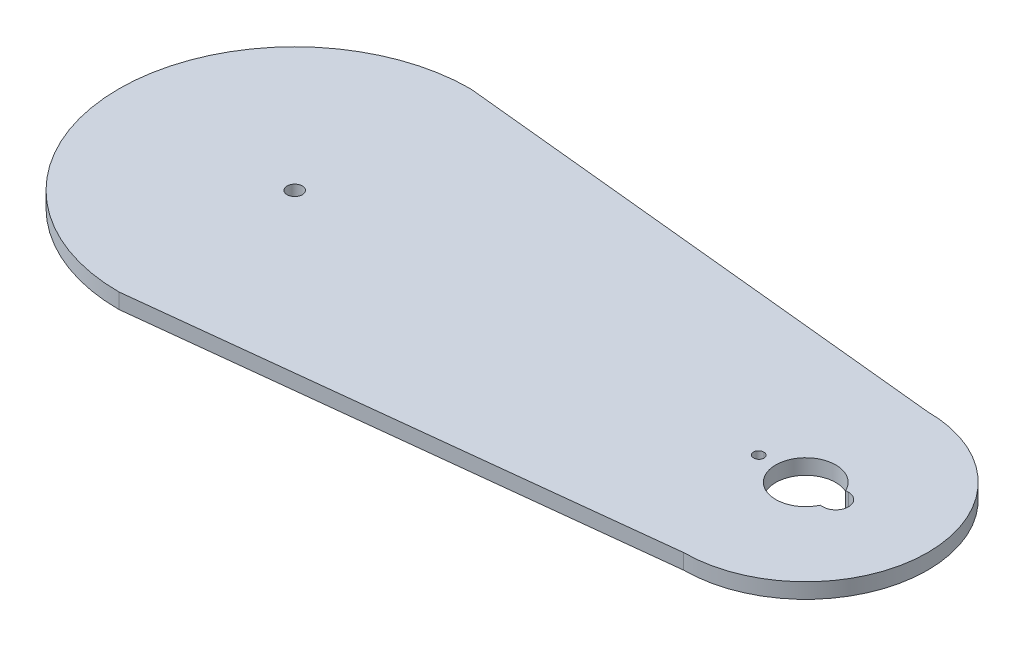
ISO-10303-21;
HEADER;
FILE_DESCRIPTION(('STEP AP214'),'2;1');
FILE_NAME('part.step','',(''),(''),'','','');
FILE_SCHEMA(('AUTOMOTIVE_DESIGN { 1 0 10303 214 1 1 1 1 }'));
ENDSEC;
DATA;
#1=APPLICATION_CONTEXT('core data for automotive mechanical design processes');
#2=APPLICATION_PROTOCOL_DEFINITION('international standard','automotive_design',2000,#1);
#3=PRODUCT_CONTEXT('',#1,'mechanical');
#4=PRODUCT('Part','Part','',(#3));
#5=PRODUCT_RELATED_PRODUCT_CATEGORY('part','',(#4));
#6=PRODUCT_DEFINITION_FORMATION('','',#4);
#7=PRODUCT_DEFINITION_CONTEXT('part definition',#1,'design');
#8=PRODUCT_DEFINITION('design','',#6,#7);
#9=PRODUCT_DEFINITION_SHAPE('','',#8);
#10=(LENGTH_UNIT() NAMED_UNIT(*) SI_UNIT(.MILLI.,.METRE.));
#11=(NAMED_UNIT(*) PLANE_ANGLE_UNIT() SI_UNIT($,.RADIAN.));
#12=(NAMED_UNIT(*) SI_UNIT($,.STERADIAN.) SOLID_ANGLE_UNIT());
#13=UNCERTAINTY_MEASURE_WITH_UNIT(LENGTH_MEASURE(1.E-05),#10,'distance_accuracy_value','');
#14=(GEOMETRIC_REPRESENTATION_CONTEXT(3) GLOBAL_UNCERTAINTY_ASSIGNED_CONTEXT((#13)) GLOBAL_UNIT_ASSIGNED_CONTEXT((#10,
#11,#12)) REPRESENTATION_CONTEXT('',''));
#15=CARTESIAN_POINT('',(0.,0.,0.));
#16=DIRECTION('',(0.,0.,1.));
#17=DIRECTION('',(1.,0.,0.));
#18=AXIS2_PLACEMENT_3D('',#15,#16,#17);
#19=CARTESIAN_POINT('',(0.,3.,-24.));
#20=DIRECTION('',(0.,-1.,0.));
#21=DIRECTION('',(0.,0.,-1.));
#22=AXIS2_PLACEMENT_3D('',#19,#20,#21);
#23=CYLINDRICAL_SURFACE('',#22,24.);
#24=CARTESIAN_POINT('',(0.,0.,-24.));
#25=DIRECTION('',(0.,1.,0.));
#26=DIRECTION('',(0.,0.,-1.));
#27=AXIS2_PLACEMENT_3D('',#24,#25,#26);
#28=CIRCLE('',#27,24.);
#29=CARTESIAN_POINT('',(0.,0.,0.));
#30=VERTEX_POINT('',#29);
#31=CARTESIAN_POINT('',(0.,0.,-48.));
#32=VERTEX_POINT('',#31);
#33=EDGE_CURVE('E143',#30,#32,#28,.T.);
#34=ORIENTED_EDGE('',*,*,#33,.T.);
#35=DIRECTION('',(0.,-1.,0.));
#36=VECTOR('',#35,1.);
#37=CARTESIAN_POINT('',(0.,3.,-48.));
#38=LINE('',#37,#36);
#39=CARTESIAN_POINT('',(0.,3.,-48.));
#40=VERTEX_POINT('',#39);
#41=EDGE_CURVE('E175',#40,#32,#38,.T.);
#42=ORIENTED_EDGE('',*,*,#41,.F.);
#43=CARTESIAN_POINT('',(0.,3.,-24.));
#44=DIRECTION('',(0.,1.,0.));
#45=DIRECTION('',(0.,0.,-1.));
#46=AXIS2_PLACEMENT_3D('',#43,#44,#45);
#47=CIRCLE('',#46,24.);
#48=CARTESIAN_POINT('',(0.,3.,0.));
#49=VERTEX_POINT('',#48);
#50=EDGE_CURVE('E149',#49,#40,#47,.T.);
#51=ORIENTED_EDGE('',*,*,#50,.F.);
#52=DIRECTION('',(0.,-1.,0.));
#53=VECTOR('',#52,1.);
#54=CARTESIAN_POINT('',(0.,3.,0.));
#55=LINE('',#54,#53);
#56=EDGE_CURVE('E159',#49,#30,#55,.T.);
#57=ORIENTED_EDGE('',*,*,#56,.T.);
#58=EDGE_LOOP('',(#34,#42,#51,#57));
#59=FACE_BOUND('',#58,.T.);
#60=ADVANCED_FACE('F33',(#59),#23,.T.);
#61=CARTESIAN_POINT('',(-100.,3.,-58.0615795313177));
#62=DIRECTION('',(-0.10011033594273,0.,0.994976341747599));
#63=DIRECTION('',(0.994976341747599,0.,0.10011033594273));
#64=AXIS2_PLACEMENT_3D('',#61,#62,#63);
#65=PLANE('',#64);
#66=DIRECTION('',(-0.994976341747598,0.,-0.10011033594273));
#67=VECTOR('',#66,1.);
#68=CARTESIAN_POINT('',(-100.,0.,-58.0615795313177));
#69=LINE('',#68,#67);
#70=CARTESIAN_POINT('',(-100.,0.,-58.0615795313177));
#71=VERTEX_POINT('',#70);
#72=EDGE_CURVE('E162',#32,#71,#69,.T.);
#73=ORIENTED_EDGE('',*,*,#72,.T.);
#74=DIRECTION('',(0.,-1.,0.));
#75=VECTOR('',#74,1.);
#76=CARTESIAN_POINT('',(-100.,3.,-58.0615795313177));
#77=LINE('',#76,#75);
#78=CARTESIAN_POINT('',(-100.,3.,-58.0615795313177));
#79=VERTEX_POINT('',#78);
#80=EDGE_CURVE('E172',#79,#71,#77,.T.);
#81=ORIENTED_EDGE('',*,*,#80,.F.);
#82=DIRECTION('',(-0.994976341747598,0.,-0.10011033594273));
#83=VECTOR('',#82,1.);
#84=CARTESIAN_POINT('',(-100.,3.,-58.0615795313177));
#85=LINE('',#84,#83);
#86=EDGE_CURVE('E152',#40,#79,#85,.T.);
#87=ORIENTED_EDGE('',*,*,#86,.F.);
#88=ORIENTED_EDGE('',*,*,#41,.T.);
#89=EDGE_LOOP('',(#73,#81,#87,#88));
#90=FACE_BOUND('',#89,.T.);
#91=ADVANCED_FACE('F209',(#90),#65,.F.);
#92=CARTESIAN_POINT('',(-100.,3.,-23.4579039810428));
#93=DIRECTION('',(0.,-1.,0.));
#94=DIRECTION('',(0.,0.,-1.));
#95=AXIS2_PLACEMENT_3D('',#92,#93,#94);
#96=CYLINDRICAL_SURFACE('',#95,34.6036755502749);
#97=CARTESIAN_POINT('',(-100.,0.,-23.4579039810428));
#98=DIRECTION('',(0.,1.,0.));
#99=DIRECTION('',(0.,0.,1.));
#100=AXIS2_PLACEMENT_3D('',#97,#98,#99);
#101=CIRCLE('',#100,34.6036755502749);
#102=CARTESIAN_POINT('',(-100.,0.,11.1457715692321));
#103=VERTEX_POINT('',#102);
#104=EDGE_CURVE('E164',#71,#103,#101,.T.);
#105=ORIENTED_EDGE('',*,*,#104,.T.);
#106=DIRECTION('',(0.,-1.,0.));
#107=VECTOR('',#106,1.);
#108=CARTESIAN_POINT('',(-100.,3.,11.1457715692321));
#109=LINE('',#108,#107);
#110=CARTESIAN_POINT('',(-100.,3.,11.1457715692321));
#111=VERTEX_POINT('',#110);
#112=EDGE_CURVE('E169',#111,#103,#109,.T.);
#113=ORIENTED_EDGE('',*,*,#112,.F.);
#114=CARTESIAN_POINT('',(-100.,3.,-23.4579039810428));
#115=DIRECTION('',(0.,1.,0.));
#116=DIRECTION('',(0.,0.,1.));
#117=AXIS2_PLACEMENT_3D('',#114,#115,#116);
#118=CIRCLE('',#117,34.6036755502749);
#119=EDGE_CURVE('E155',#79,#111,#118,.T.);
#120=ORIENTED_EDGE('',*,*,#119,.F.);
#121=ORIENTED_EDGE('',*,*,#80,.T.);
#122=EDGE_LOOP('',(#105,#113,#120,#121));
#123=FACE_BOUND('',#122,.T.);
#124=ADVANCED_FACE('F204',(#123),#96,.T.);
#125=CARTESIAN_POINT('',(0.,3.,0.));
#126=DIRECTION('',(-0.110771790261545,0.,-0.993845868574324));
#127=DIRECTION('',(-0.993845868574324,0.,0.110771790261545));
#128=AXIS2_PLACEMENT_3D('',#125,#126,#127);
#129=PLANE('',#128);
#130=DIRECTION('',(0.993845868574324,0.,-0.110771790261545));
#131=VECTOR('',#130,1.);
#132=CARTESIAN_POINT('',(0.,0.,0.));
#133=LINE('',#132,#131);
#134=EDGE_CURVE('E153',#103,#30,#133,.T.);
#135=ORIENTED_EDGE('',*,*,#134,.T.);
#136=ORIENTED_EDGE('',*,*,#56,.F.);
#137=DIRECTION('',(0.993845868574324,0.,-0.110771790261545));
#138=VECTOR('',#137,1.);
#139=CARTESIAN_POINT('',(0.,3.,0.));
#140=LINE('',#139,#138);
#141=EDGE_CURVE('E157',#111,#49,#140,.T.);
#142=ORIENTED_EDGE('',*,*,#141,.F.);
#143=ORIENTED_EDGE('',*,*,#112,.T.);
#144=EDGE_LOOP('',(#135,#136,#142,#143));
#145=FACE_BOUND('',#144,.T.);
#146=ADVANCED_FACE('F196',(#145),#129,.F.);
#147=CARTESIAN_POINT('',(0.,3.,-24.));
#148=DIRECTION('',(0.,-1.,0.));
#149=DIRECTION('',(0.,0.,-1.));
#150=AXIS2_PLACEMENT_3D('',#147,#148,#149);
#151=PLANE('',#150);
#152=CARTESIAN_POINT('',(-100.,3.,-23.4579039810428));
#153=DIRECTION('',(0.,1.,0.));
#154=DIRECTION('',(0.,0.,1.));
#155=AXIS2_PLACEMENT_3D('',#152,#153,#154);
#156=CIRCLE('',#155,1.5);
#157=CARTESIAN_POINT('',(-100.,3.,-21.9579039810428));
#158=VERTEX_POINT('',#157);
#159=EDGE_CURVE('E126',#158,#158,#156,.T.);
#160=ORIENTED_EDGE('',*,*,#159,.F.);
#161=EDGE_LOOP('',(#160));
#162=FACE_BOUND('',#161,.T.);
#163=CARTESIAN_POINT('',(-9.2,3.,-24.));
#164=DIRECTION('',(0.,1.,0.));
#165=DIRECTION('',(0.,0.,1.));
#166=AXIS2_PLACEMENT_3D('',#163,#164,#165);
#167=CIRCLE('',#166,1.);
#168=CARTESIAN_POINT('',(-9.24999999999999,3.,-23.0012507822281));
#169=VERTEX_POINT('',#168);
#170=CARTESIAN_POINT('',(-9.24999999999999,3.,-24.9987492177719));
#171=VERTEX_POINT('',#170);
#172=EDGE_CURVE('E117',#169,#171,#167,.T.);
#173=ORIENTED_EDGE('',*,*,#172,.F.);
#174=CARTESIAN_POINT('',(-9.3,3.,-24.));
#175=DIRECTION('',(0.,1.,0.));
#176=DIRECTION('',(0.,0.,1.));
#177=AXIS2_PLACEMENT_3D('',#174,#175,#176);
#178=CIRCLE('',#177,1.);
#179=EDGE_CURVE('E108',#171,#169,#178,.T.);
#180=ORIENTED_EDGE('',*,*,#179,.F.);
#181=EDGE_LOOP('',(#173,#180));
#182=FACE_BOUND('',#181,.T.);
#183=DIRECTION('',(1.,0.,0.));
#184=VECTOR('',#183,1.);
#185=CARTESIAN_POINT('',(5.90415568635496,3.,-21.5));
#186=LINE('',#185,#184);
#187=CARTESIAN_POINT('',(5.34415568635495,3.,-21.5));
#188=VERTEX_POINT('',#187);
#189=CARTESIAN_POINT('',(5.90415568635496,3.,-21.5));
#190=VERTEX_POINT('',#189);
#191=EDGE_CURVE('E131',#188,#190,#186,.T.);
#192=ORIENTED_EDGE('',*,*,#191,.F.);
#193=CARTESIAN_POINT('',(0.,3.,-24.));
#194=DIRECTION('',(0.,1.,0.));
#195=DIRECTION('',(0.,0.,1.));
#196=AXIS2_PLACEMENT_3D('',#193,#194,#195);
#197=CIRCLE('',#196,5.9);
#198=CARTESIAN_POINT('',(5.34415568635495,3.,-26.5));
#199=VERTEX_POINT('',#198);
#200=EDGE_CURVE('E55',#199,#188,#197,.T.);
#201=ORIENTED_EDGE('',*,*,#200,.F.);
#202=DIRECTION('',(-1.,0.,0.));
#203=VECTOR('',#202,1.);
#204=CARTESIAN_POINT('',(5.34415568635495,3.,-26.5));
#205=LINE('',#204,#203);
#206=CARTESIAN_POINT('',(5.90415568635496,3.,-26.5));
#207=VERTEX_POINT('',#206);
#208=EDGE_CURVE('E137',#207,#199,#205,.T.);
#209=ORIENTED_EDGE('',*,*,#208,.F.);
#210=CARTESIAN_POINT('',(5.90415568635496,3.,-24.));
#211=DIRECTION('',(0.,1.,0.));
#212=DIRECTION('',(0.,0.,-1.));
#213=AXIS2_PLACEMENT_3D('',#210,#211,#212);
#214=CIRCLE('',#213,2.5);
#215=EDGE_CURVE('E134',#190,#207,#214,.T.);
#216=ORIENTED_EDGE('',*,*,#215,.F.);
#217=EDGE_LOOP('',(#192,#201,#209,#216));
#218=FACE_BOUND('',#217,.T.);
#219=ORIENTED_EDGE('',*,*,#50,.T.);
#220=ORIENTED_EDGE('',*,*,#86,.T.);
#221=ORIENTED_EDGE('',*,*,#119,.T.);
#222=ORIENTED_EDGE('',*,*,#141,.T.);
#223=EDGE_LOOP('',(#219,#220,#221,#222));
#224=FACE_BOUND('',#223,.T.);
#225=ADVANCED_FACE('F120',(#162,#182,#218,#224),#151,.F.);
#226=CARTESIAN_POINT('',(0.,0.,-24.));
#227=DIRECTION('',(0.,-1.,0.));
#228=DIRECTION('',(0.,0.,-1.));
#229=AXIS2_PLACEMENT_3D('',#226,#227,#228);
#230=PLANE('',#229);
#231=CARTESIAN_POINT('',(-9.3,0.,-24.));
#232=DIRECTION('',(0.,1.,0.));
#233=DIRECTION('',(0.,0.,1.));
#234=AXIS2_PLACEMENT_3D('',#231,#232,#233);
#235=CIRCLE('',#234,1.);
#236=CARTESIAN_POINT('',(-9.24999999999999,0.,-24.9987492177719));
#237=VERTEX_POINT('',#236);
#238=CARTESIAN_POINT('',(-9.24999999999999,0.,-23.0012507822281));
#239=VERTEX_POINT('',#238);
#240=EDGE_CURVE('E47',#237,#239,#235,.T.);
#241=ORIENTED_EDGE('',*,*,#240,.T.);
#242=CARTESIAN_POINT('',(-9.2,0.,-24.));
#243=DIRECTION('',(0.,-1.,0.));
#244=DIRECTION('',(0.,0.,-1.));
#245=AXIS2_PLACEMENT_3D('',#242,#243,#244);
#246=CIRCLE('',#245,1.);
#247=EDGE_CURVE('E119',#237,#239,#246,.T.);
#248=ORIENTED_EDGE('',*,*,#247,.F.);
#249=EDGE_LOOP('',(#241,#248));
#250=FACE_BOUND('',#249,.T.);
#251=CARTESIAN_POINT('',(-100.,0.,-23.4579039810428));
#252=DIRECTION('',(0.,-1.,0.));
#253=DIRECTION('',(0.,0.,-1.));
#254=AXIS2_PLACEMENT_3D('',#251,#252,#253);
#255=CIRCLE('',#254,1.5);
#256=CARTESIAN_POINT('',(-100.,0.,-24.9579039810428));
#257=VERTEX_POINT('',#256);
#258=EDGE_CURVE('E122',#257,#257,#255,.T.);
#259=ORIENTED_EDGE('',*,*,#258,.F.);
#260=EDGE_LOOP('',(#259));
#261=FACE_BOUND('',#260,.T.);
#262=CARTESIAN_POINT('',(0.,0.,-24.));
#263=DIRECTION('',(0.,-1.,0.));
#264=DIRECTION('',(0.,0.,-1.));
#265=AXIS2_PLACEMENT_3D('',#262,#263,#264);
#266=CIRCLE('',#265,5.9);
#267=CARTESIAN_POINT('',(5.34415568635495,0.,-21.5));
#268=VERTEX_POINT('',#267);
#269=CARTESIAN_POINT('',(5.34415568635495,0.,-26.5));
#270=VERTEX_POINT('',#269);
#271=EDGE_CURVE('E185',#268,#270,#266,.T.);
#272=ORIENTED_EDGE('',*,*,#271,.F.);
#273=DIRECTION('',(-1.,0.,0.));
#274=VECTOR('',#273,1.);
#275=CARTESIAN_POINT('',(0.,0.,-21.5));
#276=LINE('',#275,#274);
#277=CARTESIAN_POINT('',(5.90415568635496,0.,-21.5));
#278=VERTEX_POINT('',#277);
#279=EDGE_CURVE('E178',#278,#268,#276,.T.);
#280=ORIENTED_EDGE('',*,*,#279,.F.);
#281=CARTESIAN_POINT('',(5.90415568635496,0.,-24.));
#282=DIRECTION('',(0.,-1.,0.));
#283=DIRECTION('',(0.,0.,-1.));
#284=AXIS2_PLACEMENT_3D('',#281,#282,#283);
#285=CIRCLE('',#284,2.5);
#286=CARTESIAN_POINT('',(5.90415568635496,0.,-26.5));
#287=VERTEX_POINT('',#286);
#288=EDGE_CURVE('E180',#287,#278,#285,.T.);
#289=ORIENTED_EDGE('',*,*,#288,.F.);
#290=DIRECTION('',(1.,0.,0.));
#291=VECTOR('',#290,1.);
#292=CARTESIAN_POINT('',(0.,0.,-26.5));
#293=LINE('',#292,#291);
#294=EDGE_CURVE('E183',#270,#287,#293,.T.);
#295=ORIENTED_EDGE('',*,*,#294,.F.);
#296=EDGE_LOOP('',(#272,#280,#289,#295));
#297=FACE_BOUND('',#296,.T.);
#298=ORIENTED_EDGE('',*,*,#33,.F.);
#299=ORIENTED_EDGE('',*,*,#134,.F.);
#300=ORIENTED_EDGE('',*,*,#104,.F.);
#301=ORIENTED_EDGE('',*,*,#72,.F.);
#302=EDGE_LOOP('',(#298,#299,#300,#301));
#303=FACE_BOUND('',#302,.T.);
#304=ADVANCED_FACE('F187',(#250,#261,#297,#303),#230,.T.);
#305=CARTESIAN_POINT('',(0.,-7.,-24.));
#306=DIRECTION('',(0.,1.,0.));
#307=DIRECTION('',(0.,0.,1.));
#308=AXIS2_PLACEMENT_3D('',#305,#306,#307);
#309=CYLINDRICAL_SURFACE('',#308,5.9);
#310=ORIENTED_EDGE('',*,*,#271,.T.);
#311=DIRECTION('',(0.,1.,0.));
#312=VECTOR('',#311,1.);
#313=CARTESIAN_POINT('',(5.34415568635495,-7.,-26.5));
#314=LINE('',#313,#312);
#315=EDGE_CURVE('E141',#270,#199,#314,.T.);
#316=ORIENTED_EDGE('',*,*,#315,.T.);
#317=ORIENTED_EDGE('',*,*,#200,.T.);
#318=DIRECTION('',(0.,1.,0.));
#319=VECTOR('',#318,1.);
#320=CARTESIAN_POINT('',(5.34415568635495,-7.,-21.5));
#321=LINE('',#320,#319);
#322=EDGE_CURVE('E140',#268,#188,#321,.T.);
#323=ORIENTED_EDGE('',*,*,#322,.F.);
#324=EDGE_LOOP('',(#310,#316,#317,#323));
#325=FACE_BOUND('',#324,.T.);
#326=ADVANCED_FACE('F202',(#325),#309,.F.);
#327=CARTESIAN_POINT('',(5.34415568635495,-7.,-26.5));
#328=DIRECTION('',(0.,0.,-1.));
#329=DIRECTION('',(-1.,0.,0.));
#330=AXIS2_PLACEMENT_3D('',#327,#328,#329);
#331=PLANE('',#330);
#332=ORIENTED_EDGE('',*,*,#294,.T.);
#333=DIRECTION('',(0.,1.,0.));
#334=VECTOR('',#333,1.);
#335=CARTESIAN_POINT('',(5.90415568635496,-7.,-26.5));
#336=LINE('',#335,#334);
#337=EDGE_CURVE('E144',#287,#207,#336,.T.);
#338=ORIENTED_EDGE('',*,*,#337,.T.);
#339=ORIENTED_EDGE('',*,*,#208,.T.);
#340=ORIENTED_EDGE('',*,*,#315,.F.);
#341=EDGE_LOOP('',(#332,#338,#339,#340));
#342=FACE_BOUND('',#341,.T.);
#343=ADVANCED_FACE('F248',(#342),#331,.F.);
#344=CARTESIAN_POINT('',(5.90415568635496,-7.,-24.));
#345=DIRECTION('',(0.,1.,0.));
#346=DIRECTION('',(0.,0.,1.));
#347=AXIS2_PLACEMENT_3D('',#344,#345,#346);
#348=CYLINDRICAL_SURFACE('',#347,2.5);
#349=ORIENTED_EDGE('',*,*,#288,.T.);
#350=DIRECTION('',(0.,1.,0.));
#351=VECTOR('',#350,1.);
#352=CARTESIAN_POINT('',(5.90415568635496,-7.,-21.5));
#353=LINE('',#352,#351);
#354=EDGE_CURVE('E146',#278,#190,#353,.T.);
#355=ORIENTED_EDGE('',*,*,#354,.T.);
#356=ORIENTED_EDGE('',*,*,#215,.T.);
#357=ORIENTED_EDGE('',*,*,#337,.F.);
#358=EDGE_LOOP('',(#349,#355,#356,#357));
#359=FACE_BOUND('',#358,.T.);
#360=ADVANCED_FACE('F257',(#359),#348,.F.);
#361=CARTESIAN_POINT('',(5.90415568635496,-7.,-21.5));
#362=DIRECTION('',(0.,0.,1.));
#363=DIRECTION('',(1.,0.,0.));
#364=AXIS2_PLACEMENT_3D('',#361,#362,#363);
#365=PLANE('',#364);
#366=ORIENTED_EDGE('',*,*,#279,.T.);
#367=ORIENTED_EDGE('',*,*,#322,.T.);
#368=ORIENTED_EDGE('',*,*,#191,.T.);
#369=ORIENTED_EDGE('',*,*,#354,.F.);
#370=EDGE_LOOP('',(#366,#367,#368,#369));
#371=FACE_BOUND('',#370,.T.);
#372=ADVANCED_FACE('F267',(#371),#365,.F.);
#373=CARTESIAN_POINT('',(-9.2,-7.,-24.));
#374=DIRECTION('',(0.,1.,0.));
#375=DIRECTION('',(0.,0.,1.));
#376=AXIS2_PLACEMENT_3D('',#373,#374,#375);
#377=CYLINDRICAL_SURFACE('',#376,1.);
#378=ORIENTED_EDGE('',*,*,#247,.T.);
#379=DIRECTION('',(0.,1.,0.));
#380=VECTOR('',#379,1.);
#381=CARTESIAN_POINT('',(-9.24999999999999,1.5,-23.0012507822281));
#382=LINE('',#381,#380);
#383=EDGE_CURVE('E11',#239,#169,#382,.T.);
#384=ORIENTED_EDGE('',*,*,#383,.T.);
#385=ORIENTED_EDGE('',*,*,#172,.T.);
#386=DIRECTION('',(0.,1.,0.));
#387=VECTOR('',#386,1.);
#388=CARTESIAN_POINT('',(-9.24999999999999,1.5,-24.9987492177719));
#389=LINE('',#388,#387);
#390=EDGE_CURVE('E40',#171,#237,#389,.F.);
#391=ORIENTED_EDGE('',*,*,#390,.T.);
#392=EDGE_LOOP('',(#378,#384,#385,#391));
#393=FACE_BOUND('',#392,.T.);
#394=ADVANCED_FACE('F116',(#393),#377,.F.);
#395=CARTESIAN_POINT('',(-100.,-7.,-23.4579039810428));
#396=DIRECTION('',(0.,1.,0.));
#397=DIRECTION('',(0.,0.,1.));
#398=AXIS2_PLACEMENT_3D('',#395,#396,#397);
#399=CYLINDRICAL_SURFACE('',#398,1.5);
#400=ORIENTED_EDGE('',*,*,#258,.T.);
#401=EDGE_LOOP('',(#400));
#402=FACE_BOUND('',#401,.T.);
#403=ORIENTED_EDGE('',*,*,#159,.T.);
#404=EDGE_LOOP('',(#403));
#405=FACE_BOUND('',#404,.T.);
#406=ADVANCED_FACE('F193',(#402,#405),#399,.F.);
#407=CARTESIAN_POINT('',(-9.3,0.,-24.));
#408=DIRECTION('',(0.,1.,0.));
#409=DIRECTION('',(0.,0.,1.));
#410=AXIS2_PLACEMENT_3D('',#407,#408,#409);
#411=CYLINDRICAL_SURFACE('',#410,1.);
#412=ORIENTED_EDGE('',*,*,#240,.F.);
#413=ORIENTED_EDGE('',*,*,#390,.F.);
#414=ORIENTED_EDGE('',*,*,#179,.T.);
#415=ORIENTED_EDGE('',*,*,#383,.F.);
#416=EDGE_LOOP('',(#412,#413,#414,#415));
#417=FACE_BOUND('',#416,.T.);
#418=ADVANCED_FACE('F109',(#417),#411,.F.);
#419=CLOSED_SHELL('',(#60,#91,#124,#146,#225,#304,#326,#343,#360,#372,#394,#406,#418));
#420=MANIFOLD_SOLID_BREP('B2',#419);
#421=ADVANCED_BREP_SHAPE_REPRESENTATION('',(#18,#420),#14);
#422=SHAPE_DEFINITION_REPRESENTATION(#9,#421);
ENDSEC;
END-ISO-10303-21;
